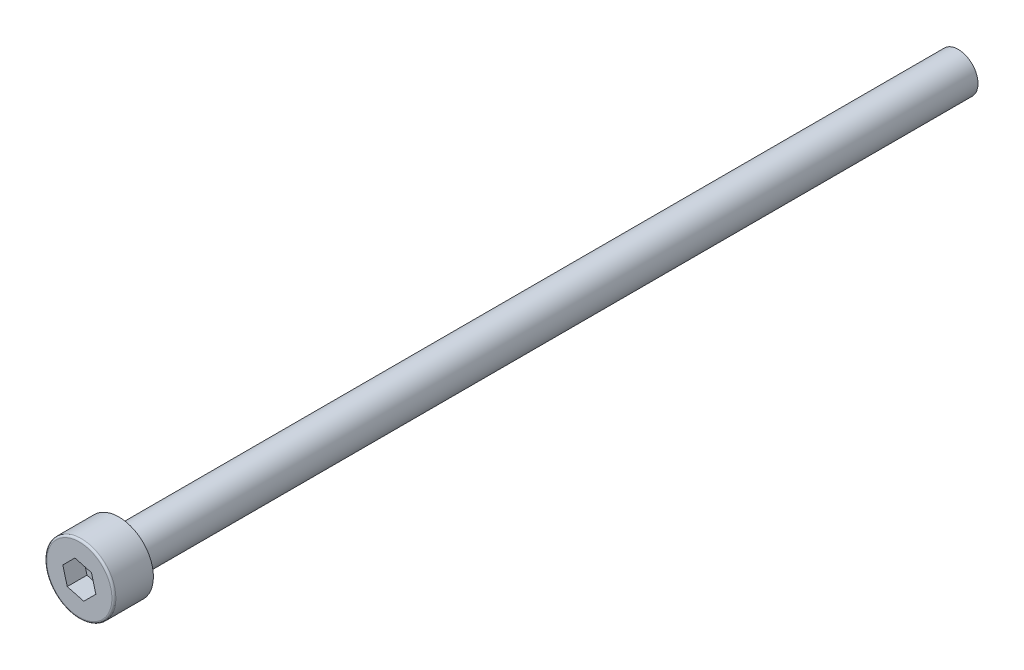
ISO-10303-21;
HEADER;
FILE_DESCRIPTION(('STEP AP214'),'2;1');
FILE_NAME('part.step','',(''),(''),'','','');
FILE_SCHEMA(('AUTOMOTIVE_DESIGN { 1 0 10303 214 1 1 1 1 }'));
ENDSEC;
DATA;
#1=APPLICATION_CONTEXT('core data for automotive mechanical design processes');
#2=APPLICATION_PROTOCOL_DEFINITION('international standard','automotive_design',2000,#1);
#3=PRODUCT_CONTEXT('',#1,'mechanical');
#4=PRODUCT('Part','Part','',(#3));
#5=PRODUCT_RELATED_PRODUCT_CATEGORY('part','',(#4));
#6=PRODUCT_DEFINITION_FORMATION('','',#4);
#7=PRODUCT_DEFINITION_CONTEXT('part definition',#1,'design');
#8=PRODUCT_DEFINITION('design','',#6,#7);
#9=PRODUCT_DEFINITION_SHAPE('','',#8);
#10=(LENGTH_UNIT() NAMED_UNIT(*) SI_UNIT(.MILLI.,.METRE.));
#11=(NAMED_UNIT(*) PLANE_ANGLE_UNIT() SI_UNIT($,.RADIAN.));
#12=(NAMED_UNIT(*) SI_UNIT($,.STERADIAN.) SOLID_ANGLE_UNIT());
#13=UNCERTAINTY_MEASURE_WITH_UNIT(LENGTH_MEASURE(1.E-05),#10,'distance_accuracy_value','');
#14=(GEOMETRIC_REPRESENTATION_CONTEXT(3) GLOBAL_UNCERTAINTY_ASSIGNED_CONTEXT((#13)) GLOBAL_UNIT_ASSIGNED_CONTEXT((#10,
#11,#12)) REPRESENTATION_CONTEXT('',''));
#15=CARTESIAN_POINT('',(0.,0.,0.));
#16=DIRECTION('',(0.,0.,1.));
#17=DIRECTION('',(1.,0.,0.));
#18=AXIS2_PLACEMENT_3D('',#15,#16,#17);
#19=CARTESIAN_POINT('',(0.,0.,0.));
#20=DIRECTION('',(0.,0.,1.));
#21=DIRECTION('',(1.,0.,0.));
#22=AXIS2_PLACEMENT_3D('',#19,#20,#21);
#23=PLANE('',#22);
#24=CARTESIAN_POINT('',(0.,0.,0.));
#25=DIRECTION('',(0.,0.,1.));
#26=DIRECTION('',(1.,0.,0.));
#27=AXIS2_PLACEMENT_3D('',#24,#25,#26);
#28=CIRCLE('',#27,3.5);
#29=CARTESIAN_POINT('',(3.5,0.,0.));
#30=VERTEX_POINT('',#29);
#31=EDGE_CURVE('E138',#30,#30,#28,.T.);
#32=ORIENTED_EDGE('',*,*,#31,.F.);
#33=EDGE_LOOP('',(#32));
#34=FACE_BOUND('',#33,.T.);
#35=CARTESIAN_POINT('',(0.,0.,0.));
#36=DIRECTION('',(0.,0.,1.));
#37=DIRECTION('',(1.,0.,0.));
#38=AXIS2_PLACEMENT_3D('',#35,#36,#37);
#39=CIRCLE('',#38,2.);
#40=CARTESIAN_POINT('',(2.,0.,0.));
#41=VERTEX_POINT('',#40);
#42=EDGE_CURVE('E146',#41,#41,#39,.F.);
#43=ORIENTED_EDGE('',*,*,#42,.F.);
#44=EDGE_LOOP('',(#43));
#45=FACE_BOUND('',#44,.T.);
#46=ADVANCED_FACE('F35',(#34,#45),#23,.F.);
#47=CARTESIAN_POINT('',(0.,0.,4.));
#48=DIRECTION('',(0.,0.,-1.));
#49=DIRECTION('',(-1.,0.,0.));
#50=AXIS2_PLACEMENT_3D('',#47,#48,#49);
#51=CYLINDRICAL_SURFACE('',#50,3.5);
#52=CARTESIAN_POINT('',(0.,0.,3.8));
#53=DIRECTION('',(0.,0.,1.));
#54=DIRECTION('',(1.,0.,0.));
#55=AXIS2_PLACEMENT_3D('',#52,#53,#54);
#56=CIRCLE('',#55,3.5);
#57=CARTESIAN_POINT('',(3.5,0.,3.8));
#58=VERTEX_POINT('',#57);
#59=EDGE_CURVE('E11',#58,#58,#56,.F.);
#60=ORIENTED_EDGE('',*,*,#59,.T.);
#61=EDGE_LOOP('',(#60));
#62=FACE_BOUND('',#61,.T.);
#63=ORIENTED_EDGE('',*,*,#31,.T.);
#64=EDGE_LOOP('',(#63));
#65=FACE_BOUND('',#64,.T.);
#66=ADVANCED_FACE('F165',(#62,#65),#51,.T.);
#67=CARTESIAN_POINT('',(0.,0.,4.));
#68=DIRECTION('',(0.,0.,1.));
#69=DIRECTION('',(1.,0.,0.));
#70=AXIS2_PLACEMENT_3D('',#67,#68,#69);
#71=PLANE('',#70);
#72=CARTESIAN_POINT('',(0.,0.,4.));
#73=DIRECTION('',(0.,0.,1.));
#74=DIRECTION('',(1.,0.,0.));
#75=AXIS2_PLACEMENT_3D('',#72,#73,#74);
#76=CIRCLE('',#75,3.3);
#77=CARTESIAN_POINT('',(3.3,0.,4.));
#78=VERTEX_POINT('',#77);
#79=EDGE_CURVE('E43',#78,#78,#76,.T.);
#80=ORIENTED_EDGE('',*,*,#79,.T.);
#81=EDGE_LOOP('',(#80));
#82=FACE_BOUND('',#81,.T.);
#83=DIRECTION('',(0.258819045102521,-0.965925826289068,0.));
#84=VECTOR('',#83,1.);
#85=CARTESIAN_POINT('',(-1.67303260747562,0.448287736084027,4.));
#86=LINE('',#85,#84);
#87=CARTESIAN_POINT('',(-1.67303260747562,0.448287736084027,4.));
#88=VERTEX_POINT('',#87);
#89=CARTESIAN_POINT('',(-1.22474487139159,-1.22474487139159,4.));
#90=VERTEX_POINT('',#89);
#91=EDGE_CURVE('E50',#88,#90,#86,.T.);
#92=ORIENTED_EDGE('',*,*,#91,.F.);
#93=DIRECTION('',(-0.707106781186547,-0.707106781186548,0.));
#94=VECTOR('',#93,1.);
#95=CARTESIAN_POINT('',(-0.448287736084027,1.67303260747562,4.));
#96=LINE('',#95,#94);
#97=CARTESIAN_POINT('',(-0.448287736084027,1.67303260747562,4.));
#98=VERTEX_POINT('',#97);
#99=EDGE_CURVE('E134',#98,#88,#96,.T.);
#100=ORIENTED_EDGE('',*,*,#99,.F.);
#101=DIRECTION('',(-0.965925826289068,0.258819045102521,0.));
#102=VECTOR('',#101,1.);
#103=CARTESIAN_POINT('',(1.22474487139159,1.22474487139159,4.));
#104=LINE('',#103,#102);
#105=CARTESIAN_POINT('',(1.22474487139159,1.22474487139159,4.));
#106=VERTEX_POINT('',#105);
#107=EDGE_CURVE('E132',#106,#98,#104,.T.);
#108=ORIENTED_EDGE('',*,*,#107,.F.);
#109=DIRECTION('',(-0.258819045102521,0.965925826289068,0.));
#110=VECTOR('',#109,1.);
#111=CARTESIAN_POINT('',(1.67303260747562,-0.448287736084027,4.));
#112=LINE('',#111,#110);
#113=CARTESIAN_POINT('',(1.67303260747562,-0.448287736084027,4.));
#114=VERTEX_POINT('',#113);
#115=EDGE_CURVE('E98',#114,#106,#112,.T.);
#116=ORIENTED_EDGE('',*,*,#115,.F.);
#117=DIRECTION('',(0.707106781186547,0.707106781186548,0.));
#118=VECTOR('',#117,1.);
#119=CARTESIAN_POINT('',(0.448287736084026,-1.67303260747562,4.));
#120=LINE('',#119,#118);
#121=CARTESIAN_POINT('',(0.448287736084026,-1.67303260747562,4.));
#122=VERTEX_POINT('',#121);
#123=EDGE_CURVE('E128',#122,#114,#120,.T.);
#124=ORIENTED_EDGE('',*,*,#123,.F.);
#125=DIRECTION('',(0.965925826289068,-0.258819045102521,0.));
#126=VECTOR('',#125,1.);
#127=CARTESIAN_POINT('',(-1.22474487139159,-1.22474487139159,4.));
#128=LINE('',#127,#126);
#129=EDGE_CURVE('E124',#90,#122,#128,.T.);
#130=ORIENTED_EDGE('',*,*,#129,.F.);
#131=EDGE_LOOP('',(#92,#100,#108,#116,#124,#130));
#132=FACE_BOUND('',#131,.T.);
#133=ADVANCED_FACE('F151',(#82,#132),#71,.T.);
#134=CARTESIAN_POINT('',(-1.67303260747562,0.448287736084027,2.));
#135=DIRECTION('',(-0.965925826289068,-0.258819045102521,0.));
#136=DIRECTION('',(0.258819045102521,-0.965925826289068,0.));
#137=AXIS2_PLACEMENT_3D('',#134,#135,#136);
#138=PLANE('',#137);
#139=ORIENTED_EDGE('',*,*,#91,.T.);
#140=DIRECTION('',(0.,0.,1.));
#141=VECTOR('',#140,1.);
#142=CARTESIAN_POINT('',(-1.22474487139159,-1.22474487139159,2.));
#143=LINE('',#142,#141);
#144=CARTESIAN_POINT('',(-1.22474487139159,-1.22474487139159,2.));
#145=VERTEX_POINT('',#144);
#146=EDGE_CURVE('E80',#145,#90,#143,.T.);
#147=ORIENTED_EDGE('',*,*,#146,.F.);
#148=DIRECTION('',(0.258819045102521,-0.965925826289068,0.));
#149=VECTOR('',#148,1.);
#150=CARTESIAN_POINT('',(-1.67303260747562,0.448287736084027,2.));
#151=LINE('',#150,#149);
#152=CARTESIAN_POINT('',(-1.67303260747562,0.448287736084027,2.));
#153=VERTEX_POINT('',#152);
#154=EDGE_CURVE('E136',#153,#145,#151,.T.);
#155=ORIENTED_EDGE('',*,*,#154,.F.);
#156=DIRECTION('',(0.,0.,1.));
#157=VECTOR('',#156,1.);
#158=CARTESIAN_POINT('',(-1.67303260747562,0.448287736084027,2.));
#159=LINE('',#158,#157);
#160=EDGE_CURVE('E58',#153,#88,#159,.T.);
#161=ORIENTED_EDGE('',*,*,#160,.T.);
#162=EDGE_LOOP('',(#139,#147,#155,#161));
#163=FACE_BOUND('',#162,.T.);
#164=ADVANCED_FACE('F177',(#163),#138,.F.);
#165=CARTESIAN_POINT('',(-0.448287736084027,1.67303260747562,2.));
#166=DIRECTION('',(-0.707106781186548,0.707106781186547,0.));
#167=DIRECTION('',(-0.707106781186547,-0.707106781186548,0.));
#168=AXIS2_PLACEMENT_3D('',#165,#166,#167);
#169=PLANE('',#168);
#170=ORIENTED_EDGE('',*,*,#99,.T.);
#171=ORIENTED_EDGE('',*,*,#160,.F.);
#172=DIRECTION('',(-0.707106781186547,-0.707106781186548,0.));
#173=VECTOR('',#172,1.);
#174=CARTESIAN_POINT('',(-0.448287736084027,1.67303260747562,2.));
#175=LINE('',#174,#173);
#176=CARTESIAN_POINT('',(-0.448287736084027,1.67303260747562,2.));
#177=VERTEX_POINT('',#176);
#178=EDGE_CURVE('E110',#177,#153,#175,.T.);
#179=ORIENTED_EDGE('',*,*,#178,.F.);
#180=DIRECTION('',(0.,0.,1.));
#181=VECTOR('',#180,1.);
#182=CARTESIAN_POINT('',(-0.448287736084027,1.67303260747562,2.));
#183=LINE('',#182,#181);
#184=EDGE_CURVE('E102',#177,#98,#183,.T.);
#185=ORIENTED_EDGE('',*,*,#184,.T.);
#186=EDGE_LOOP('',(#170,#171,#179,#185));
#187=FACE_BOUND('',#186,.T.);
#188=ADVANCED_FACE('F180',(#187),#169,.F.);
#189=CARTESIAN_POINT('',(1.22474487139159,1.22474487139159,2.));
#190=DIRECTION('',(0.258819045102521,0.965925826289068,0.));
#191=DIRECTION('',(-0.965925826289068,0.258819045102521,0.));
#192=AXIS2_PLACEMENT_3D('',#189,#190,#191);
#193=PLANE('',#192);
#194=ORIENTED_EDGE('',*,*,#107,.T.);
#195=ORIENTED_EDGE('',*,*,#184,.F.);
#196=DIRECTION('',(-0.965925826289068,0.258819045102521,0.));
#197=VECTOR('',#196,1.);
#198=CARTESIAN_POINT('',(1.22474487139159,1.22474487139159,2.));
#199=LINE('',#198,#197);
#200=CARTESIAN_POINT('',(1.22474487139159,1.22474487139159,2.));
#201=VERTEX_POINT('',#200);
#202=EDGE_CURVE('E106',#201,#177,#199,.T.);
#203=ORIENTED_EDGE('',*,*,#202,.F.);
#204=DIRECTION('',(0.,0.,1.));
#205=VECTOR('',#204,1.);
#206=CARTESIAN_POINT('',(1.22474487139159,1.22474487139159,2.));
#207=LINE('',#206,#205);
#208=EDGE_CURVE('E91',#201,#106,#207,.T.);
#209=ORIENTED_EDGE('',*,*,#208,.T.);
#210=EDGE_LOOP('',(#194,#195,#203,#209));
#211=FACE_BOUND('',#210,.T.);
#212=ADVANCED_FACE('F107',(#211),#193,.F.);
#213=CARTESIAN_POINT('',(1.67303260747562,-0.448287736084027,2.));
#214=DIRECTION('',(0.965925826289068,0.258819045102521,0.));
#215=DIRECTION('',(-0.258819045102521,0.965925826289068,0.));
#216=AXIS2_PLACEMENT_3D('',#213,#214,#215);
#217=PLANE('',#216);
#218=ORIENTED_EDGE('',*,*,#115,.T.);
#219=ORIENTED_EDGE('',*,*,#208,.F.);
#220=DIRECTION('',(-0.258819045102521,0.965925826289068,0.));
#221=VECTOR('',#220,1.);
#222=CARTESIAN_POINT('',(1.67303260747562,-0.448287736084027,2.));
#223=LINE('',#222,#221);
#224=CARTESIAN_POINT('',(1.67303260747562,-0.448287736084027,2.));
#225=VERTEX_POINT('',#224);
#226=EDGE_CURVE('E95',#225,#201,#223,.T.);
#227=ORIENTED_EDGE('',*,*,#226,.F.);
#228=DIRECTION('',(0.,0.,1.));
#229=VECTOR('',#228,1.);
#230=CARTESIAN_POINT('',(1.67303260747562,-0.448287736084027,2.));
#231=LINE('',#230,#229);
#232=EDGE_CURVE('E103',#225,#114,#231,.T.);
#233=ORIENTED_EDGE('',*,*,#232,.T.);
#234=EDGE_LOOP('',(#218,#219,#227,#233));
#235=FACE_BOUND('',#234,.T.);
#236=ADVANCED_FACE('F93',(#235),#217,.F.);
#237=CARTESIAN_POINT('',(0.448287736084026,-1.67303260747562,2.));
#238=DIRECTION('',(0.707106781186548,-0.707106781186547,0.));
#239=DIRECTION('',(0.707106781186547,0.707106781186548,0.));
#240=AXIS2_PLACEMENT_3D('',#237,#238,#239);
#241=PLANE('',#240);
#242=ORIENTED_EDGE('',*,*,#123,.T.);
#243=ORIENTED_EDGE('',*,*,#232,.F.);
#244=DIRECTION('',(0.707106781186547,0.707106781186548,0.));
#245=VECTOR('',#244,1.);
#246=CARTESIAN_POINT('',(0.448287736084026,-1.67303260747562,2.));
#247=LINE('',#246,#245);
#248=CARTESIAN_POINT('',(0.448287736084026,-1.67303260747562,2.));
#249=VERTEX_POINT('',#248);
#250=EDGE_CURVE('E116',#249,#225,#247,.T.);
#251=ORIENTED_EDGE('',*,*,#250,.F.);
#252=DIRECTION('',(0.,0.,1.));
#253=VECTOR('',#252,1.);
#254=CARTESIAN_POINT('',(0.448287736084026,-1.67303260747562,2.));
#255=LINE('',#254,#253);
#256=EDGE_CURVE('E141',#249,#122,#255,.T.);
#257=ORIENTED_EDGE('',*,*,#256,.T.);
#258=EDGE_LOOP('',(#242,#243,#251,#257));
#259=FACE_BOUND('',#258,.T.);
#260=ADVANCED_FACE('F184',(#259),#241,.F.);
#261=CARTESIAN_POINT('',(-1.22474487139159,-1.22474487139159,2.));
#262=DIRECTION('',(-0.258819045102521,-0.965925826289068,0.));
#263=DIRECTION('',(0.965925826289068,-0.258819045102521,0.));
#264=AXIS2_PLACEMENT_3D('',#261,#262,#263);
#265=PLANE('',#264);
#266=ORIENTED_EDGE('',*,*,#129,.T.);
#267=ORIENTED_EDGE('',*,*,#256,.F.);
#268=DIRECTION('',(0.965925826289068,-0.258819045102521,0.));
#269=VECTOR('',#268,1.);
#270=CARTESIAN_POINT('',(-1.22474487139159,-1.22474487139159,2.));
#271=LINE('',#270,#269);
#272=EDGE_CURVE('E118',#145,#249,#271,.T.);
#273=ORIENTED_EDGE('',*,*,#272,.F.);
#274=ORIENTED_EDGE('',*,*,#146,.T.);
#275=EDGE_LOOP('',(#266,#267,#273,#274));
#276=FACE_BOUND('',#275,.T.);
#277=ADVANCED_FACE('F181',(#276),#265,.F.);
#278=CARTESIAN_POINT('',(0.,0.,2.));
#279=DIRECTION('',(0.,0.,1.));
#280=DIRECTION('',(1.,0.,0.));
#281=AXIS2_PLACEMENT_3D('',#278,#279,#280);
#282=PLANE('',#281);
#283=ORIENTED_EDGE('',*,*,#154,.T.);
#284=ORIENTED_EDGE('',*,*,#272,.T.);
#285=ORIENTED_EDGE('',*,*,#250,.T.);
#286=ORIENTED_EDGE('',*,*,#226,.T.);
#287=ORIENTED_EDGE('',*,*,#202,.T.);
#288=ORIENTED_EDGE('',*,*,#178,.T.);
#289=EDGE_LOOP('',(#283,#284,#285,#286,#287,#288));
#290=FACE_BOUND('',#289,.T.);
#291=ADVANCED_FACE('F113',(#290),#282,.T.);
#292=CARTESIAN_POINT('',(0.,0.,-85.));
#293=DIRECTION('',(0.,0.,1.));
#294=DIRECTION('',(1.,0.,0.));
#295=AXIS2_PLACEMENT_3D('',#292,#293,#294);
#296=CYLINDRICAL_SURFACE('',#295,2.);
#297=CARTESIAN_POINT('',(0.,0.,-85.));
#298=DIRECTION('',(0.,0.,-1.));
#299=DIRECTION('',(-1.,0.,0.));
#300=AXIS2_PLACEMENT_3D('',#297,#298,#299);
#301=CIRCLE('',#300,2.);
#302=CARTESIAN_POINT('',(-2.,0.,-85.));
#303=VERTEX_POINT('',#302);
#304=EDGE_CURVE('E125',#303,#303,#301,.T.);
#305=ORIENTED_EDGE('',*,*,#304,.F.);
#306=EDGE_LOOP('',(#305));
#307=FACE_BOUND('',#306,.T.);
#308=ORIENTED_EDGE('',*,*,#42,.T.);
#309=EDGE_LOOP('',(#308));
#310=FACE_BOUND('',#309,.T.);
#311=ADVANCED_FACE('F160',(#307,#310),#296,.T.);
#312=CARTESIAN_POINT('',(0.,0.,-85.));
#313=DIRECTION('',(0.,0.,-1.));
#314=DIRECTION('',(-1.,0.,0.));
#315=AXIS2_PLACEMENT_3D('',#312,#313,#314);
#316=PLANE('',#315);
#317=ORIENTED_EDGE('',*,*,#304,.T.);
#318=EDGE_LOOP('',(#317));
#319=FACE_BOUND('',#318,.T.);
#320=ADVANCED_FACE('F155',(#319),#316,.T.);
#321=CARTESIAN_POINT('',(0.,0.,3.8));
#322=DIRECTION('',(0.,0.,1.));
#323=DIRECTION('',(1.,0.,0.));
#324=AXIS2_PLACEMENT_3D('',#321,#322,#323);
#325=TOROIDAL_SURFACE('',#324,3.3,0.2);
#326=ORIENTED_EDGE('',*,*,#59,.F.);
#327=EDGE_LOOP('',(#326));
#328=FACE_BOUND('',#327,.T.);
#329=ORIENTED_EDGE('',*,*,#79,.F.);
#330=EDGE_LOOP('',(#329));
#331=FACE_BOUND('',#330,.T.);
#332=ADVANCED_FACE('F37',(#328,#331),#325,.T.);
#333=CLOSED_SHELL('',(#46,#66,#133,#164,#188,#212,#236,#260,#277,#291,#311,#320,#332));
#334=MANIFOLD_SOLID_BREP('B2',#333);
#335=ADVANCED_BREP_SHAPE_REPRESENTATION('',(#18,#334),#14);
#336=SHAPE_DEFINITION_REPRESENTATION(#9,#335);
ENDSEC;
END-ISO-10303-21;
